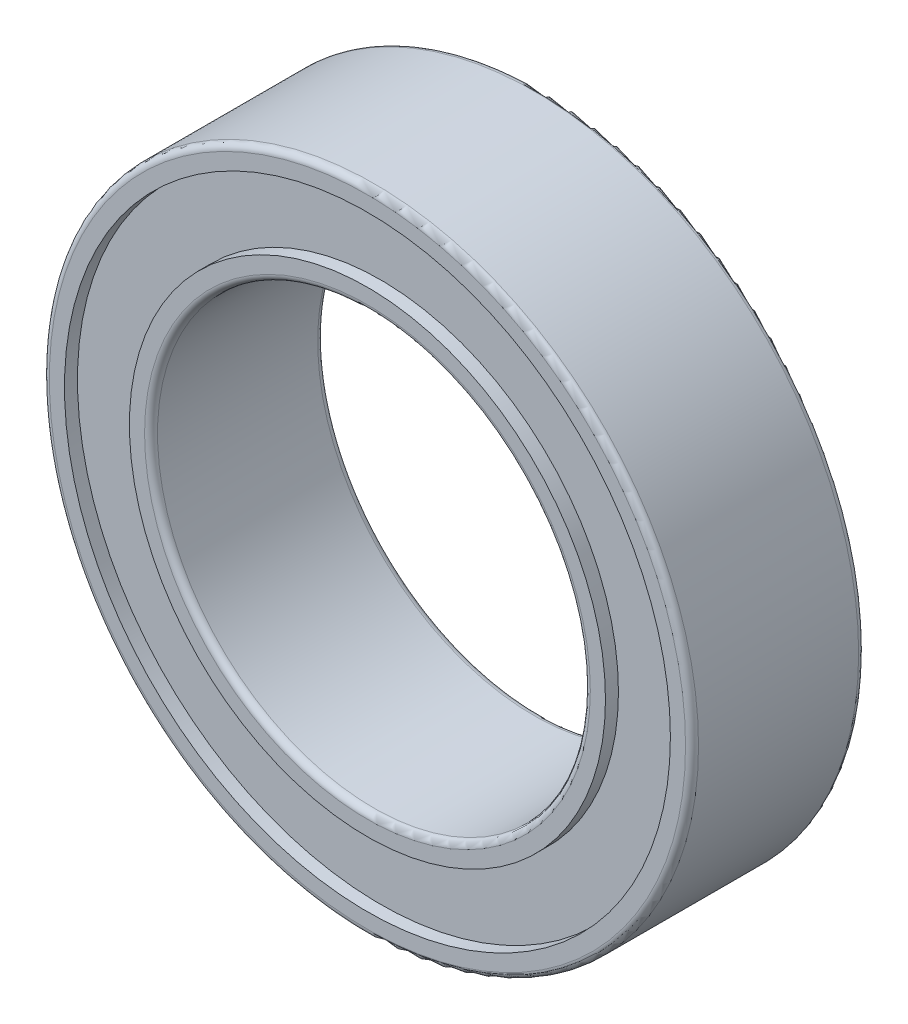
ISO-10303-21;
HEADER;
FILE_DESCRIPTION(('STEP AP214'),'2;1');
FILE_NAME('part.step','',(''),(''),'','','');
FILE_SCHEMA(('AUTOMOTIVE_DESIGN { 1 0 10303 214 1 1 1 1 }'));
ENDSEC;
DATA;
#1=APPLICATION_CONTEXT('core data for automotive mechanical design processes');
#2=APPLICATION_PROTOCOL_DEFINITION('international standard','automotive_design',2000,#1);
#3=PRODUCT_CONTEXT('',#1,'mechanical');
#4=PRODUCT('Part','Part','',(#3));
#5=PRODUCT_RELATED_PRODUCT_CATEGORY('part','',(#4));
#6=PRODUCT_DEFINITION_FORMATION('','',#4);
#7=PRODUCT_DEFINITION_CONTEXT('part definition',#1,'design');
#8=PRODUCT_DEFINITION('design','',#6,#7);
#9=PRODUCT_DEFINITION_SHAPE('','',#8);
#10=(LENGTH_UNIT() NAMED_UNIT(*) SI_UNIT(.MILLI.,.METRE.));
#11=(NAMED_UNIT(*) PLANE_ANGLE_UNIT() SI_UNIT($,.RADIAN.));
#12=(NAMED_UNIT(*) SI_UNIT($,.STERADIAN.) SOLID_ANGLE_UNIT());
#13=UNCERTAINTY_MEASURE_WITH_UNIT(LENGTH_MEASURE(1.E-05),#10,'distance_accuracy_value','');
#14=(GEOMETRIC_REPRESENTATION_CONTEXT(3) GLOBAL_UNCERTAINTY_ASSIGNED_CONTEXT((#13)) GLOBAL_UNIT_ASSIGNED_CONTEXT((#10,
#11,#12)) REPRESENTATION_CONTEXT('',''));
#15=CARTESIAN_POINT('',(0.,0.,0.));
#16=DIRECTION('',(0.,0.,1.));
#17=DIRECTION('',(1.,0.,0.));
#18=AXIS2_PLACEMENT_3D('',#15,#16,#17);
#19=CARTESIAN_POINT('',(0.,0.,0.));
#20=DIRECTION('',(0.,0.,1.));
#21=DIRECTION('',(1.,0.,0.));
#22=AXIS2_PLACEMENT_3D('',#19,#20,#21);
#23=PLANE('',#22);
#24=CARTESIAN_POINT('',(0.,0.,0.));
#25=DIRECTION('',(0.,0.,1.));
#26=DIRECTION('',(1.,0.,0.));
#27=AXIS2_PLACEMENT_3D('',#24,#25,#26);
#28=CIRCLE('',#27,5.15);
#29=CARTESIAN_POINT('',(5.15,0.,0.));
#30=VERTEX_POINT('',#29);
#31=EDGE_CURVE('E62',#30,#30,#28,.T.);
#32=ORIENTED_EDGE('',*,*,#31,.T.);
#33=EDGE_LOOP('',(#32));
#34=FACE_BOUND('',#33,.T.);
#35=CARTESIAN_POINT('',(0.,0.,0.));
#36=DIRECTION('',(0.,0.,1.));
#37=DIRECTION('',(1.,0.,0.));
#38=AXIS2_PLACEMENT_3D('',#35,#36,#37);
#39=CIRCLE('',#38,5.5);
#40=CARTESIAN_POINT('',(5.5,0.,0.));
#41=VERTEX_POINT('',#40);
#42=EDGE_CURVE('E84',#41,#41,#39,.T.);
#43=ORIENTED_EDGE('',*,*,#42,.F.);
#44=EDGE_LOOP('',(#43));
#45=FACE_BOUND('',#44,.T.);
#46=ADVANCED_FACE('F33',(#34,#45),#23,.F.);
#47=CARTESIAN_POINT('',(0.,0.,4.));
#48=DIRECTION('',(0.,0.,1.));
#49=DIRECTION('',(1.,0.,0.));
#50=AXIS2_PLACEMENT_3D('',#47,#48,#49);
#51=PLANE('',#50);
#52=CARTESIAN_POINT('',(0.,0.,4.));
#53=DIRECTION('',(0.,0.,1.));
#54=DIRECTION('',(1.,0.,0.));
#55=AXIS2_PLACEMENT_3D('',#52,#53,#54);
#56=CIRCLE('',#55,5.15);
#57=CARTESIAN_POINT('',(5.15,0.,4.));
#58=VERTEX_POINT('',#57);
#59=EDGE_CURVE('E40',#58,#58,#56,.F.);
#60=ORIENTED_EDGE('',*,*,#59,.T.);
#61=EDGE_LOOP('',(#60));
#62=FACE_BOUND('',#61,.T.);
#63=CARTESIAN_POINT('',(0.,0.,4.));
#64=DIRECTION('',(0.,0.,1.));
#65=DIRECTION('',(1.,0.,0.));
#66=AXIS2_PLACEMENT_3D('',#63,#64,#65);
#67=CIRCLE('',#66,5.5);
#68=CARTESIAN_POINT('',(5.5,0.,4.));
#69=VERTEX_POINT('',#68);
#70=EDGE_CURVE('E72',#69,#69,#67,.T.);
#71=ORIENTED_EDGE('',*,*,#70,.T.);
#72=EDGE_LOOP('',(#71));
#73=FACE_BOUND('',#72,.T.);
#74=ADVANCED_FACE('F101',(#62,#73),#51,.T.);
#75=CARTESIAN_POINT('',(0.,0.,4.));
#76=DIRECTION('',(0.,0.,1.));
#77=DIRECTION('',(1.,0.,0.));
#78=AXIS2_PLACEMENT_3D('',#75,#76,#77);
#79=CIRCLE('',#78,7.35);
#80=CARTESIAN_POINT('',(7.35,0.,4.));
#81=VERTEX_POINT('',#80);
#82=EDGE_CURVE('E10',#81,#81,#79,.T.);
#83=ORIENTED_EDGE('',*,*,#82,.T.);
#84=EDGE_LOOP('',(#83));
#85=FACE_BOUND('',#84,.T.);
#86=CARTESIAN_POINT('',(0.,0.,4.));
#87=DIRECTION('',(0.,0.,1.));
#88=DIRECTION('',(1.,0.,0.));
#89=AXIS2_PLACEMENT_3D('',#86,#87,#88);
#90=CIRCLE('',#89,7.);
#91=CARTESIAN_POINT('',(7.,0.,4.));
#92=VERTEX_POINT('',#91);
#93=EDGE_CURVE('E66',#92,#92,#90,.T.);
#94=ORIENTED_EDGE('',*,*,#93,.F.);
#95=EDGE_LOOP('',(#94));
#96=FACE_BOUND('',#95,.T.);
#97=ADVANCED_FACE('F108',(#85,#96),#51,.T.);
#98=CARTESIAN_POINT('',(0.,0.,0.));
#99=DIRECTION('',(0.,0.,1.));
#100=DIRECTION('',(1.,0.,0.));
#101=AXIS2_PLACEMENT_3D('',#98,#99,#100);
#102=CIRCLE('',#101,7.35);
#103=CARTESIAN_POINT('',(7.35,0.,0.));
#104=VERTEX_POINT('',#103);
#105=EDGE_CURVE('E44',#104,#104,#102,.F.);
#106=ORIENTED_EDGE('',*,*,#105,.T.);
#107=EDGE_LOOP('',(#106));
#108=FACE_BOUND('',#107,.T.);
#109=CARTESIAN_POINT('',(0.,0.,0.));
#110=DIRECTION('',(0.,0.,1.));
#111=DIRECTION('',(1.,0.,0.));
#112=AXIS2_PLACEMENT_3D('',#109,#110,#111);
#113=CIRCLE('',#112,7.);
#114=CARTESIAN_POINT('',(7.,0.,0.));
#115=VERTEX_POINT('',#114);
#116=EDGE_CURVE('E78',#115,#115,#113,.T.);
#117=ORIENTED_EDGE('',*,*,#116,.T.);
#118=EDGE_LOOP('',(#117));
#119=FACE_BOUND('',#118,.T.);
#120=ADVANCED_FACE('F104',(#108,#119),#23,.F.);
#121=CARTESIAN_POINT('',(0.,0.,4.));
#122=DIRECTION('',(0.,0.,-1.));
#123=DIRECTION('',(-1.,0.,0.));
#124=AXIS2_PLACEMENT_3D('',#121,#122,#123);
#125=CYLINDRICAL_SURFACE('',#124,7.5);
#126=CARTESIAN_POINT('',(0.,0.,0.15));
#127=DIRECTION('',(0.,0.,1.));
#128=DIRECTION('',(1.,0.,0.));
#129=AXIS2_PLACEMENT_3D('',#126,#127,#128);
#130=CIRCLE('',#129,7.5);
#131=CARTESIAN_POINT('',(7.5,0.,0.15));
#132=VERTEX_POINT('',#131);
#133=EDGE_CURVE('E48',#132,#132,#130,.T.);
#134=ORIENTED_EDGE('',*,*,#133,.T.);
#135=EDGE_LOOP('',(#134));
#136=FACE_BOUND('',#135,.T.);
#137=CARTESIAN_POINT('',(0.,0.,3.85));
#138=DIRECTION('',(0.,0.,1.));
#139=DIRECTION('',(1.,0.,0.));
#140=AXIS2_PLACEMENT_3D('',#137,#138,#139);
#141=CIRCLE('',#140,7.5);
#142=CARTESIAN_POINT('',(7.5,0.,3.85));
#143=VERTEX_POINT('',#142);
#144=EDGE_CURVE('E53',#143,#143,#141,.F.);
#145=ORIENTED_EDGE('',*,*,#144,.T.);
#146=EDGE_LOOP('',(#145));
#147=FACE_BOUND('',#146,.T.);
#148=ADVANCED_FACE('F112',(#136,#147),#125,.T.);
#149=CARTESIAN_POINT('',(0.,0.,4.));
#150=DIRECTION('',(0.,0.,-1.));
#151=DIRECTION('',(-1.,0.,0.));
#152=AXIS2_PLACEMENT_3D('',#149,#150,#151);
#153=CYLINDRICAL_SURFACE('',#152,5.);
#154=CARTESIAN_POINT('',(0.,0.,0.15));
#155=DIRECTION('',(0.,0.,1.));
#156=DIRECTION('',(1.,0.,0.));
#157=AXIS2_PLACEMENT_3D('',#154,#155,#156);
#158=CIRCLE('',#157,5.);
#159=CARTESIAN_POINT('',(5.,0.,0.15));
#160=VERTEX_POINT('',#159);
#161=EDGE_CURVE('E56',#160,#160,#158,.F.);
#162=ORIENTED_EDGE('',*,*,#161,.T.);
#163=EDGE_LOOP('',(#162));
#164=FACE_BOUND('',#163,.T.);
#165=CARTESIAN_POINT('',(0.,0.,3.85));
#166=DIRECTION('',(0.,0.,1.));
#167=DIRECTION('',(1.,0.,0.));
#168=AXIS2_PLACEMENT_3D('',#165,#166,#167);
#169=CIRCLE('',#168,5.);
#170=CARTESIAN_POINT('',(5.,0.,3.85));
#171=VERTEX_POINT('',#170);
#172=EDGE_CURVE('E59',#171,#171,#169,.T.);
#173=ORIENTED_EDGE('',*,*,#172,.T.);
#174=EDGE_LOOP('',(#173));
#175=FACE_BOUND('',#174,.T.);
#176=ADVANCED_FACE('F118',(#164,#175),#153,.F.);
#177=CARTESIAN_POINT('',(0.,0.,3.7));
#178=DIRECTION('',(0.,0.,1.));
#179=DIRECTION('',(1.,0.,0.));
#180=AXIS2_PLACEMENT_3D('',#177,#178,#179);
#181=CYLINDRICAL_SURFACE('',#180,7.);
#182=CARTESIAN_POINT('',(0.,0.,3.7));
#183=DIRECTION('',(0.,0.,1.));
#184=DIRECTION('',(1.,0.,0.));
#185=AXIS2_PLACEMENT_3D('',#182,#183,#184);
#186=CIRCLE('',#185,7.);
#187=CARTESIAN_POINT('',(7.,0.,3.7));
#188=VERTEX_POINT('',#187);
#189=EDGE_CURVE('E65',#188,#188,#186,.T.);
#190=ORIENTED_EDGE('',*,*,#189,.F.);
#191=EDGE_LOOP('',(#190));
#192=FACE_BOUND('',#191,.T.);
#193=ORIENTED_EDGE('',*,*,#93,.T.);
#194=EDGE_LOOP('',(#193));
#195=FACE_BOUND('',#194,.T.);
#196=ADVANCED_FACE('F140',(#192,#195),#181,.F.);
#197=CARTESIAN_POINT('',(0.,0.,3.7));
#198=DIRECTION('',(0.,0.,1.));
#199=DIRECTION('',(1.,0.,0.));
#200=AXIS2_PLACEMENT_3D('',#197,#198,#199);
#201=PLANE('',#200);
#202=CARTESIAN_POINT('',(0.,0.,3.7));
#203=DIRECTION('',(0.,0.,1.));
#204=DIRECTION('',(1.,0.,0.));
#205=AXIS2_PLACEMENT_3D('',#202,#203,#204);
#206=CIRCLE('',#205,5.5);
#207=CARTESIAN_POINT('',(5.5,0.,3.7));
#208=VERTEX_POINT('',#207);
#209=EDGE_CURVE('E69',#208,#208,#206,.T.);
#210=ORIENTED_EDGE('',*,*,#209,.F.);
#211=EDGE_LOOP('',(#210));
#212=FACE_BOUND('',#211,.T.);
#213=ORIENTED_EDGE('',*,*,#189,.T.);
#214=EDGE_LOOP('',(#213));
#215=FACE_BOUND('',#214,.T.);
#216=ADVANCED_FACE('F136',(#212,#215),#201,.T.);
#217=CARTESIAN_POINT('',(0.,0.,3.7));
#218=DIRECTION('',(0.,0.,1.));
#219=DIRECTION('',(1.,0.,0.));
#220=AXIS2_PLACEMENT_3D('',#217,#218,#219);
#221=CYLINDRICAL_SURFACE('',#220,5.5);
#222=ORIENTED_EDGE('',*,*,#209,.T.);
#223=EDGE_LOOP('',(#222));
#224=FACE_BOUND('',#223,.T.);
#225=ORIENTED_EDGE('',*,*,#70,.F.);
#226=EDGE_LOOP('',(#225));
#227=FACE_BOUND('',#226,.T.);
#228=ADVANCED_FACE('F130',(#224,#227),#221,.T.);
#229=CARTESIAN_POINT('',(0.,0.,0.5));
#230=DIRECTION('',(0.,0.,1.));
#231=DIRECTION('',(1.,0.,0.));
#232=AXIS2_PLACEMENT_3D('',#229,#230,#231);
#233=PLANE('',#232);
#234=CARTESIAN_POINT('',(0.,0.,0.5));
#235=DIRECTION('',(0.,0.,1.));
#236=DIRECTION('',(1.,0.,0.));
#237=AXIS2_PLACEMENT_3D('',#234,#235,#236);
#238=CIRCLE('',#237,7.);
#239=CARTESIAN_POINT('',(7.,0.,0.5));
#240=VERTEX_POINT('',#239);
#241=EDGE_CURVE('E75',#240,#240,#238,.T.);
#242=ORIENTED_EDGE('',*,*,#241,.F.);
#243=EDGE_LOOP('',(#242));
#244=FACE_BOUND('',#243,.T.);
#245=CARTESIAN_POINT('',(0.,0.,0.5));
#246=DIRECTION('',(0.,0.,1.));
#247=DIRECTION('',(1.,0.,0.));
#248=AXIS2_PLACEMENT_3D('',#245,#246,#247);
#249=CIRCLE('',#248,5.5);
#250=CARTESIAN_POINT('',(5.5,0.,0.5));
#251=VERTEX_POINT('',#250);
#252=EDGE_CURVE('E81',#251,#251,#249,.T.);
#253=ORIENTED_EDGE('',*,*,#252,.T.);
#254=EDGE_LOOP('',(#253));
#255=FACE_BOUND('',#254,.T.);
#256=ADVANCED_FACE('F90',(#244,#255),#233,.F.);
#257=CARTESIAN_POINT('',(0.,0.,0.5));
#258=DIRECTION('',(0.,0.,-1.));
#259=DIRECTION('',(-1.,0.,0.));
#260=AXIS2_PLACEMENT_3D('',#257,#258,#259);
#261=CYLINDRICAL_SURFACE('',#260,7.);
#262=ORIENTED_EDGE('',*,*,#241,.T.);
#263=EDGE_LOOP('',(#262));
#264=FACE_BOUND('',#263,.T.);
#265=ORIENTED_EDGE('',*,*,#116,.F.);
#266=EDGE_LOOP('',(#265));
#267=FACE_BOUND('',#266,.T.);
#268=ADVANCED_FACE('F96',(#264,#267),#261,.F.);
#269=CARTESIAN_POINT('',(0.,0.,0.5));
#270=DIRECTION('',(0.,0.,-1.));
#271=DIRECTION('',(-1.,0.,0.));
#272=AXIS2_PLACEMENT_3D('',#269,#270,#271);
#273=CYLINDRICAL_SURFACE('',#272,5.5);
#274=ORIENTED_EDGE('',*,*,#252,.F.);
#275=EDGE_LOOP('',(#274));
#276=FACE_BOUND('',#275,.T.);
#277=ORIENTED_EDGE('',*,*,#42,.T.);
#278=EDGE_LOOP('',(#277));
#279=FACE_BOUND('',#278,.T.);
#280=ADVANCED_FACE('F92',(#276,#279),#273,.T.);
#281=CARTESIAN_POINT('',(0.,0.,0.15));
#282=DIRECTION('',(0.,0.,1.));
#283=DIRECTION('',(1.,0.,0.));
#284=AXIS2_PLACEMENT_3D('',#281,#282,#283);
#285=TOROIDAL_SURFACE('',#284,5.15,0.15);
#286=ORIENTED_EDGE('',*,*,#161,.F.);
#287=EDGE_LOOP('',(#286));
#288=FACE_BOUND('',#287,.T.);
#289=ORIENTED_EDGE('',*,*,#31,.F.);
#290=EDGE_LOOP('',(#289));
#291=FACE_BOUND('',#290,.T.);
#292=ADVANCED_FACE('F95',(#288,#291),#285,.T.);
#293=CARTESIAN_POINT('',(0.,0.,0.15));
#294=DIRECTION('',(0.,0.,1.));
#295=DIRECTION('',(1.,0.,0.));
#296=AXIS2_PLACEMENT_3D('',#293,#294,#295);
#297=TOROIDAL_SURFACE('',#296,7.35,0.15);
#298=ORIENTED_EDGE('',*,*,#105,.F.);
#299=EDGE_LOOP('',(#298));
#300=FACE_BOUND('',#299,.T.);
#301=ORIENTED_EDGE('',*,*,#133,.F.);
#302=EDGE_LOOP('',(#301));
#303=FACE_BOUND('',#302,.T.);
#304=ADVANCED_FACE('F155',(#300,#303),#297,.T.);
#305=CARTESIAN_POINT('',(0.,0.,3.85));
#306=DIRECTION('',(0.,0.,1.));
#307=DIRECTION('',(1.,0.,0.));
#308=AXIS2_PLACEMENT_3D('',#305,#306,#307);
#309=TOROIDAL_SURFACE('',#308,5.15,0.15);
#310=ORIENTED_EDGE('',*,*,#59,.F.);
#311=EDGE_LOOP('',(#310));
#312=FACE_BOUND('',#311,.T.);
#313=ORIENTED_EDGE('',*,*,#172,.F.);
#314=EDGE_LOOP('',(#313));
#315=FACE_BOUND('',#314,.T.);
#316=ADVANCED_FACE('F153',(#312,#315),#309,.T.);
#317=CARTESIAN_POINT('',(0.,0.,3.85));
#318=DIRECTION('',(0.,0.,1.));
#319=DIRECTION('',(1.,0.,0.));
#320=AXIS2_PLACEMENT_3D('',#317,#318,#319);
#321=TOROIDAL_SURFACE('',#320,7.35,0.15);
#322=ORIENTED_EDGE('',*,*,#144,.F.);
#323=EDGE_LOOP('',(#322));
#324=FACE_BOUND('',#323,.T.);
#325=ORIENTED_EDGE('',*,*,#82,.F.);
#326=EDGE_LOOP('',(#325));
#327=FACE_BOUND('',#326,.T.);
#328=ADVANCED_FACE('F35',(#324,#327),#321,.T.);
#329=CLOSED_SHELL('',(#46,#74,#97,#120,#148,#176,#196,#216,#228,#256,#268,#280,#292,#304,#316,#328));
#330=MANIFOLD_SOLID_BREP('B2',#329);
#331=ADVANCED_BREP_SHAPE_REPRESENTATION('',(#18,#330),#14);
#332=SHAPE_DEFINITION_REPRESENTATION(#9,#331);
ENDSEC;
END-ISO-10303-21;
